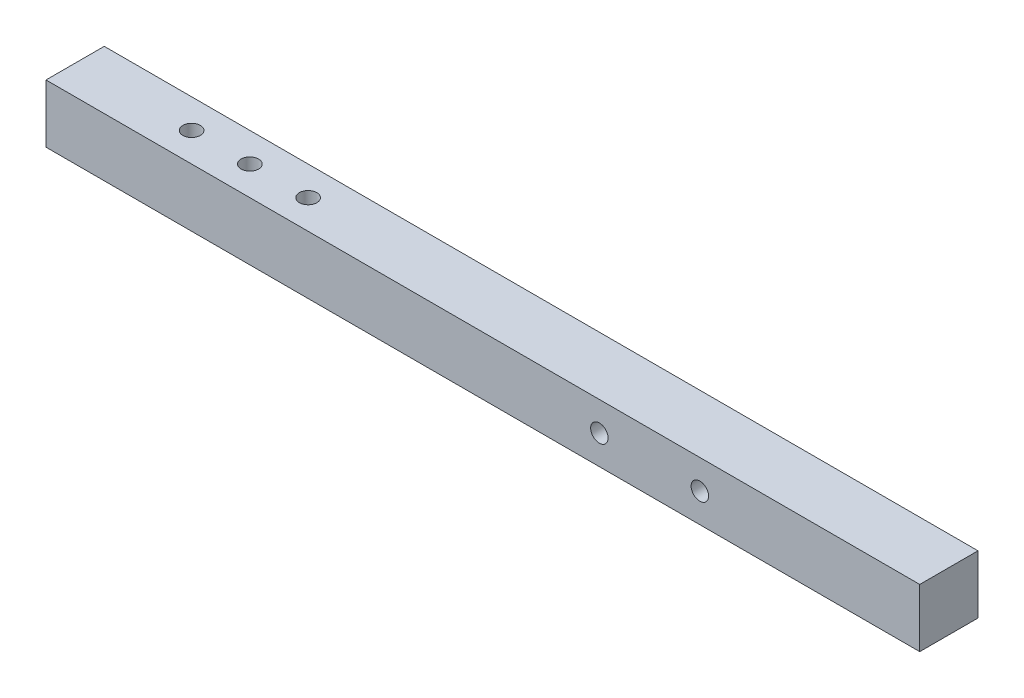
ISO-10303-21;
HEADER;
FILE_DESCRIPTION(('STEP AP214'),'2;1');
FILE_NAME('part.step','',(''),(''),'','','');
FILE_SCHEMA(('AUTOMOTIVE_DESIGN { 1 0 10303 214 1 1 1 1 }'));
ENDSEC;
DATA;
#1=APPLICATION_CONTEXT('core data for automotive mechanical design processes');
#2=APPLICATION_PROTOCOL_DEFINITION('international standard','automotive_design',2000,#1);
#3=PRODUCT_CONTEXT('',#1,'mechanical');
#4=PRODUCT('Part','Part','',(#3));
#5=PRODUCT_RELATED_PRODUCT_CATEGORY('part','',(#4));
#6=PRODUCT_DEFINITION_FORMATION('','',#4);
#7=PRODUCT_DEFINITION_CONTEXT('part definition',#1,'design');
#8=PRODUCT_DEFINITION('design','',#6,#7);
#9=PRODUCT_DEFINITION_SHAPE('','',#8);
#10=(LENGTH_UNIT() NAMED_UNIT(*) SI_UNIT(.MILLI.,.METRE.));
#11=(NAMED_UNIT(*) PLANE_ANGLE_UNIT() SI_UNIT($,.RADIAN.));
#12=(NAMED_UNIT(*) SI_UNIT($,.STERADIAN.) SOLID_ANGLE_UNIT());
#13=UNCERTAINTY_MEASURE_WITH_UNIT(LENGTH_MEASURE(1.E-05),#10,'distance_accuracy_value','');
#14=(GEOMETRIC_REPRESENTATION_CONTEXT(3) GLOBAL_UNCERTAINTY_ASSIGNED_CONTEXT((#13)) GLOBAL_UNIT_ASSIGNED_CONTEXT((#10,
#11,#12)) REPRESENTATION_CONTEXT('',''));
#15=CARTESIAN_POINT('',(0.,0.,0.));
#16=DIRECTION('',(0.,0.,1.));
#17=DIRECTION('',(1.,0.,0.));
#18=AXIS2_PLACEMENT_3D('',#15,#16,#17);
#19=CARTESIAN_POINT('',(300.,-10.,-10.));
#20=DIRECTION('',(0.,0.,1.));
#21=DIRECTION('',(1.,0.,0.));
#22=AXIS2_PLACEMENT_3D('',#19,#20,#21);
#23=PLANE('',#22);
#24=CARTESIAN_POINT('',(190.,0.,-10.));
#25=DIRECTION('',(0.,0.,1.));
#26=DIRECTION('',(1.,0.,0.));
#27=AXIS2_PLACEMENT_3D('',#24,#25,#26);
#28=CIRCLE('',#27,2.99999999999999);
#29=CARTESIAN_POINT('',(193.,0.,-10.));
#30=VERTEX_POINT('',#29);
#31=EDGE_CURVE('E114',#30,#30,#28,.T.);
#32=ORIENTED_EDGE('',*,*,#31,.T.);
#33=EDGE_LOOP('',(#32));
#34=FACE_BOUND('',#33,.T.);
#35=CARTESIAN_POINT('',(224.5,0.,-10.));
#36=DIRECTION('',(0.,0.,1.));
#37=DIRECTION('',(1.,0.,0.));
#38=AXIS2_PLACEMENT_3D('',#35,#36,#37);
#39=CIRCLE('',#38,2.99999999999999);
#40=CARTESIAN_POINT('',(227.5,0.,-10.));
#41=VERTEX_POINT('',#40);
#42=EDGE_CURVE('E131',#41,#41,#39,.T.);
#43=ORIENTED_EDGE('',*,*,#42,.T.);
#44=EDGE_LOOP('',(#43));
#45=FACE_BOUND('',#44,.T.);
#46=DIRECTION('',(0.,1.,0.));
#47=VECTOR('',#46,1.);
#48=CARTESIAN_POINT('',(0.,-10.,-10.));
#49=LINE('',#48,#47);
#50=CARTESIAN_POINT('',(0.,-10.,-10.));
#51=VERTEX_POINT('',#50);
#52=CARTESIAN_POINT('',(0.,10.,-10.));
#53=VERTEX_POINT('',#52);
#54=EDGE_CURVE('E96',#51,#53,#49,.T.);
#55=ORIENTED_EDGE('',*,*,#54,.T.);
#56=DIRECTION('',(-1.,0.,0.));
#57=VECTOR('',#56,1.);
#58=CARTESIAN_POINT('',(300.,10.,-10.));
#59=LINE('',#58,#57);
#60=CARTESIAN_POINT('',(300.,10.,-10.));
#61=VERTEX_POINT('',#60);
#62=EDGE_CURVE('E11',#61,#53,#59,.T.);
#63=ORIENTED_EDGE('',*,*,#62,.F.);
#64=DIRECTION('',(0.,1.,0.));
#65=VECTOR('',#64,1.);
#66=CARTESIAN_POINT('',(300.,-10.,-10.));
#67=LINE('',#66,#65);
#68=CARTESIAN_POINT('',(300.,-10.,-10.));
#69=VERTEX_POINT('',#68);
#70=EDGE_CURVE('E84',#69,#61,#67,.T.);
#71=ORIENTED_EDGE('',*,*,#70,.F.);
#72=DIRECTION('',(-1.,0.,0.));
#73=VECTOR('',#72,1.);
#74=CARTESIAN_POINT('',(300.,-10.,-10.));
#75=LINE('',#74,#73);
#76=EDGE_CURVE('E92',#69,#51,#75,.T.);
#77=ORIENTED_EDGE('',*,*,#76,.T.);
#78=EDGE_LOOP('',(#55,#63,#71,#77));
#79=FACE_BOUND('',#78,.T.);
#80=ADVANCED_FACE('F33',(#34,#45,#79),#23,.F.);
#81=CARTESIAN_POINT('',(300.,10.,10.));
#82=DIRECTION('',(0.,-1.,0.));
#83=DIRECTION('',(0.,0.,-1.));
#84=AXIS2_PLACEMENT_3D('',#81,#82,#83);
#85=PLANE('',#84);
#86=CARTESIAN_POINT('',(40.,10.,0.));
#87=DIRECTION('',(0.,1.,0.));
#88=DIRECTION('',(0.,0.,1.));
#89=AXIS2_PLACEMENT_3D('',#86,#87,#88);
#90=CIRCLE('',#89,3.00000000000001);
#91=CARTESIAN_POINT('',(40.,10.,3.00000000000001));
#92=VERTEX_POINT('',#91);
#93=EDGE_CURVE('E123',#92,#92,#90,.T.);
#94=ORIENTED_EDGE('',*,*,#93,.F.);
#95=EDGE_LOOP('',(#94));
#96=FACE_BOUND('',#95,.T.);
#97=CARTESIAN_POINT('',(60.,10.,0.));
#98=DIRECTION('',(0.,1.,0.));
#99=DIRECTION('',(0.,0.,1.));
#100=AXIS2_PLACEMENT_3D('',#97,#98,#99);
#101=CIRCLE('',#100,3.00000000000001);
#102=CARTESIAN_POINT('',(60.,10.,3.00000000000001));
#103=VERTEX_POINT('',#102);
#104=EDGE_CURVE('E117',#103,#103,#101,.T.);
#105=ORIENTED_EDGE('',*,*,#104,.F.);
#106=EDGE_LOOP('',(#105));
#107=FACE_BOUND('',#106,.T.);
#108=CARTESIAN_POINT('',(80.,10.,0.));
#109=DIRECTION('',(0.,1.,0.));
#110=DIRECTION('',(0.,0.,1.));
#111=AXIS2_PLACEMENT_3D('',#108,#109,#110);
#112=CIRCLE('',#111,3.00000000000001);
#113=CARTESIAN_POINT('',(80.,10.,3.00000000000001));
#114=VERTEX_POINT('',#113);
#115=EDGE_CURVE('E110',#114,#114,#112,.T.);
#116=ORIENTED_EDGE('',*,*,#115,.F.);
#117=EDGE_LOOP('',(#116));
#118=FACE_BOUND('',#117,.T.);
#119=DIRECTION('',(0.,0.,1.));
#120=VECTOR('',#119,1.);
#121=CARTESIAN_POINT('',(0.,10.,10.));
#122=LINE('',#121,#120);
#123=CARTESIAN_POINT('',(0.,10.,10.));
#124=VERTEX_POINT('',#123);
#125=EDGE_CURVE('E88',#53,#124,#122,.T.);
#126=ORIENTED_EDGE('',*,*,#125,.T.);
#127=DIRECTION('',(-1.,0.,0.));
#128=VECTOR('',#127,1.);
#129=CARTESIAN_POINT('',(300.,10.,10.));
#130=LINE('',#129,#128);
#131=CARTESIAN_POINT('',(300.,10.,10.));
#132=VERTEX_POINT('',#131);
#133=EDGE_CURVE('E41',#132,#124,#130,.T.);
#134=ORIENTED_EDGE('',*,*,#133,.F.);
#135=DIRECTION('',(0.,0.,1.));
#136=VECTOR('',#135,1.);
#137=CARTESIAN_POINT('',(300.,10.,10.));
#138=LINE('',#137,#136);
#139=EDGE_CURVE('E79',#61,#132,#138,.T.);
#140=ORIENTED_EDGE('',*,*,#139,.F.);
#141=ORIENTED_EDGE('',*,*,#62,.T.);
#142=EDGE_LOOP('',(#126,#134,#140,#141));
#143=FACE_BOUND('',#142,.T.);
#144=ADVANCED_FACE('F87',(#96,#107,#118,#143),#85,.F.);
#145=CARTESIAN_POINT('',(300.,-10.,10.));
#146=DIRECTION('',(0.,0.,-1.));
#147=DIRECTION('',(-1.,0.,0.));
#148=AXIS2_PLACEMENT_3D('',#145,#146,#147);
#149=PLANE('',#148);
#150=CARTESIAN_POINT('',(190.,0.,10.));
#151=DIRECTION('',(0.,0.,1.));
#152=DIRECTION('',(1.,0.,0.));
#153=AXIS2_PLACEMENT_3D('',#150,#151,#152);
#154=CIRCLE('',#153,2.99999999999999);
#155=CARTESIAN_POINT('',(193.,0.,10.));
#156=VERTEX_POINT('',#155);
#157=EDGE_CURVE('E134',#156,#156,#154,.T.);
#158=ORIENTED_EDGE('',*,*,#157,.F.);
#159=EDGE_LOOP('',(#158));
#160=FACE_BOUND('',#159,.T.);
#161=CARTESIAN_POINT('',(224.5,0.,10.));
#162=DIRECTION('',(0.,0.,1.));
#163=DIRECTION('',(1.,0.,0.));
#164=AXIS2_PLACEMENT_3D('',#161,#162,#163);
#165=CIRCLE('',#164,2.99999999999999);
#166=CARTESIAN_POINT('',(227.5,0.,10.));
#167=VERTEX_POINT('',#166);
#168=EDGE_CURVE('E128',#167,#167,#165,.T.);
#169=ORIENTED_EDGE('',*,*,#168,.F.);
#170=EDGE_LOOP('',(#169));
#171=FACE_BOUND('',#170,.T.);
#172=DIRECTION('',(0.,-1.,0.));
#173=VECTOR('',#172,1.);
#174=CARTESIAN_POINT('',(0.,-10.,10.));
#175=LINE('',#174,#173);
#176=CARTESIAN_POINT('',(0.,-10.,10.));
#177=VERTEX_POINT('',#176);
#178=EDGE_CURVE('E66',#124,#177,#175,.T.);
#179=ORIENTED_EDGE('',*,*,#178,.T.);
#180=DIRECTION('',(-1.,0.,0.));
#181=VECTOR('',#180,1.);
#182=CARTESIAN_POINT('',(300.,-10.,10.));
#183=LINE('',#182,#181);
#184=CARTESIAN_POINT('',(300.,-10.,10.));
#185=VERTEX_POINT('',#184);
#186=EDGE_CURVE('E89',#185,#177,#183,.T.);
#187=ORIENTED_EDGE('',*,*,#186,.F.);
#188=DIRECTION('',(0.,-1.,0.));
#189=VECTOR('',#188,1.);
#190=CARTESIAN_POINT('',(300.,-10.,10.));
#191=LINE('',#190,#189);
#192=EDGE_CURVE('E82',#132,#185,#191,.T.);
#193=ORIENTED_EDGE('',*,*,#192,.F.);
#194=ORIENTED_EDGE('',*,*,#133,.T.);
#195=EDGE_LOOP('',(#179,#187,#193,#194));
#196=FACE_BOUND('',#195,.T.);
#197=ADVANCED_FACE('F90',(#160,#171,#196),#149,.F.);
#198=CARTESIAN_POINT('',(300.,-10.,10.));
#199=DIRECTION('',(0.,1.,0.));
#200=DIRECTION('',(0.,0.,1.));
#201=AXIS2_PLACEMENT_3D('',#198,#199,#200);
#202=PLANE('',#201);
#203=CARTESIAN_POINT('',(40.,-10.,0.));
#204=DIRECTION('',(0.,1.,0.));
#205=DIRECTION('',(0.,0.,1.));
#206=AXIS2_PLACEMENT_3D('',#203,#204,#205);
#207=CIRCLE('',#206,3.00000000000001);
#208=CARTESIAN_POINT('',(40.,-10.,3.00000000000001));
#209=VERTEX_POINT('',#208);
#210=EDGE_CURVE('E99',#209,#209,#207,.T.);
#211=ORIENTED_EDGE('',*,*,#210,.T.);
#212=EDGE_LOOP('',(#211));
#213=FACE_BOUND('',#212,.T.);
#214=CARTESIAN_POINT('',(60.,-10.,0.));
#215=DIRECTION('',(0.,1.,0.));
#216=DIRECTION('',(0.,0.,1.));
#217=AXIS2_PLACEMENT_3D('',#214,#215,#216);
#218=CIRCLE('',#217,3.00000000000001);
#219=CARTESIAN_POINT('',(60.,-10.,3.00000000000001));
#220=VERTEX_POINT('',#219);
#221=EDGE_CURVE('E120',#220,#220,#218,.T.);
#222=ORIENTED_EDGE('',*,*,#221,.T.);
#223=EDGE_LOOP('',(#222));
#224=FACE_BOUND('',#223,.T.);
#225=CARTESIAN_POINT('',(80.,-10.,0.));
#226=DIRECTION('',(0.,1.,0.));
#227=DIRECTION('',(0.,0.,1.));
#228=AXIS2_PLACEMENT_3D('',#225,#226,#227);
#229=CIRCLE('',#228,3.00000000000001);
#230=CARTESIAN_POINT('',(80.,-10.,3.00000000000001));
#231=VERTEX_POINT('',#230);
#232=EDGE_CURVE('E113',#231,#231,#229,.T.);
#233=ORIENTED_EDGE('',*,*,#232,.T.);
#234=EDGE_LOOP('',(#233));
#235=FACE_BOUND('',#234,.T.);
#236=DIRECTION('',(0.,0.,-1.));
#237=VECTOR('',#236,1.);
#238=CARTESIAN_POINT('',(0.,-10.,10.));
#239=LINE('',#238,#237);
#240=EDGE_CURVE('E72',#177,#51,#239,.T.);
#241=ORIENTED_EDGE('',*,*,#240,.T.);
#242=ORIENTED_EDGE('',*,*,#76,.F.);
#243=DIRECTION('',(0.,0.,-1.));
#244=VECTOR('',#243,1.);
#245=CARTESIAN_POINT('',(300.,-10.,10.));
#246=LINE('',#245,#244);
#247=EDGE_CURVE('E49',#185,#69,#246,.T.);
#248=ORIENTED_EDGE('',*,*,#247,.F.);
#249=ORIENTED_EDGE('',*,*,#186,.T.);
#250=EDGE_LOOP('',(#241,#242,#248,#249));
#251=FACE_BOUND('',#250,.T.);
#252=ADVANCED_FACE('F104',(#213,#224,#235,#251),#202,.F.);
#253=CARTESIAN_POINT('',(300.,0.,0.));
#254=DIRECTION('',(-1.,0.,0.));
#255=DIRECTION('',(0.,0.,1.));
#256=AXIS2_PLACEMENT_3D('',#253,#254,#255);
#257=PLANE('',#256);
#258=ORIENTED_EDGE('',*,*,#70,.T.);
#259=ORIENTED_EDGE('',*,*,#139,.T.);
#260=ORIENTED_EDGE('',*,*,#192,.T.);
#261=ORIENTED_EDGE('',*,*,#247,.T.);
#262=EDGE_LOOP('',(#258,#259,#260,#261));
#263=FACE_BOUND('',#262,.T.);
#264=ADVANCED_FACE('F80',(#263),#257,.F.);
#265=CARTESIAN_POINT('',(0.,0.,0.));
#266=DIRECTION('',(-1.,0.,0.));
#267=DIRECTION('',(0.,0.,1.));
#268=AXIS2_PLACEMENT_3D('',#265,#266,#267);
#269=PLANE('',#268);
#270=ORIENTED_EDGE('',*,*,#54,.F.);
#271=ORIENTED_EDGE('',*,*,#240,.F.);
#272=ORIENTED_EDGE('',*,*,#178,.F.);
#273=ORIENTED_EDGE('',*,*,#125,.F.);
#274=EDGE_LOOP('',(#270,#271,#272,#273));
#275=FACE_BOUND('',#274,.T.);
#276=ADVANCED_FACE('F107',(#275),#269,.T.);
#277=CARTESIAN_POINT('',(80.,-10.,0.));
#278=DIRECTION('',(0.,1.,0.));
#279=DIRECTION('',(0.,0.,1.));
#280=AXIS2_PLACEMENT_3D('',#277,#278,#279);
#281=CYLINDRICAL_SURFACE('',#280,3.00000000000001);
#282=ORIENTED_EDGE('',*,*,#232,.F.);
#283=EDGE_LOOP('',(#282));
#284=FACE_BOUND('',#283,.T.);
#285=ORIENTED_EDGE('',*,*,#115,.T.);
#286=EDGE_LOOP('',(#285));
#287=FACE_BOUND('',#286,.T.);
#288=ADVANCED_FACE('F182',(#284,#287),#281,.F.);
#289=CARTESIAN_POINT('',(60.,-10.,0.));
#290=DIRECTION('',(0.,1.,0.));
#291=DIRECTION('',(0.,0.,1.));
#292=AXIS2_PLACEMENT_3D('',#289,#290,#291);
#293=CYLINDRICAL_SURFACE('',#292,3.00000000000001);
#294=ORIENTED_EDGE('',*,*,#221,.F.);
#295=EDGE_LOOP('',(#294));
#296=FACE_BOUND('',#295,.T.);
#297=ORIENTED_EDGE('',*,*,#104,.T.);
#298=EDGE_LOOP('',(#297));
#299=FACE_BOUND('',#298,.T.);
#300=ADVANCED_FACE('F161',(#296,#299),#293,.F.);
#301=CARTESIAN_POINT('',(40.,-10.,0.));
#302=DIRECTION('',(0.,1.,0.));
#303=DIRECTION('',(0.,0.,1.));
#304=AXIS2_PLACEMENT_3D('',#301,#302,#303);
#305=CYLINDRICAL_SURFACE('',#304,3.00000000000001);
#306=ORIENTED_EDGE('',*,*,#210,.F.);
#307=EDGE_LOOP('',(#306));
#308=FACE_BOUND('',#307,.T.);
#309=ORIENTED_EDGE('',*,*,#93,.T.);
#310=EDGE_LOOP('',(#309));
#311=FACE_BOUND('',#310,.T.);
#312=ADVANCED_FACE('F155',(#308,#311),#305,.F.);
#313=CARTESIAN_POINT('',(224.5,0.,-10.));
#314=DIRECTION('',(0.,0.,1.));
#315=DIRECTION('',(1.,0.,0.));
#316=AXIS2_PLACEMENT_3D('',#313,#314,#315);
#317=CYLINDRICAL_SURFACE('',#316,2.99999999999999);
#318=ORIENTED_EDGE('',*,*,#42,.F.);
#319=EDGE_LOOP('',(#318));
#320=FACE_BOUND('',#319,.T.);
#321=ORIENTED_EDGE('',*,*,#168,.T.);
#322=EDGE_LOOP('',(#321));
#323=FACE_BOUND('',#322,.T.);
#324=ADVANCED_FACE('F145',(#320,#323),#317,.F.);
#325=CARTESIAN_POINT('',(190.,0.,-10.));
#326=DIRECTION('',(0.,0.,1.));
#327=DIRECTION('',(1.,0.,0.));
#328=AXIS2_PLACEMENT_3D('',#325,#326,#327);
#329=CYLINDRICAL_SURFACE('',#328,2.99999999999999);
#330=ORIENTED_EDGE('',*,*,#31,.F.);
#331=EDGE_LOOP('',(#330));
#332=FACE_BOUND('',#331,.T.);
#333=ORIENTED_EDGE('',*,*,#157,.T.);
#334=EDGE_LOOP('',(#333));
#335=FACE_BOUND('',#334,.T.);
#336=ADVANCED_FACE('F142',(#332,#335),#329,.F.);
#337=CLOSED_SHELL('',(#80,#144,#197,#252,#264,#276,#288,#300,#312,#324,#336));
#338=MANIFOLD_SOLID_BREP('B2',#337);
#339=ADVANCED_BREP_SHAPE_REPRESENTATION('',(#18,#338),#14);
#340=SHAPE_DEFINITION_REPRESENTATION(#9,#339);
ENDSEC;
END-ISO-10303-21;
